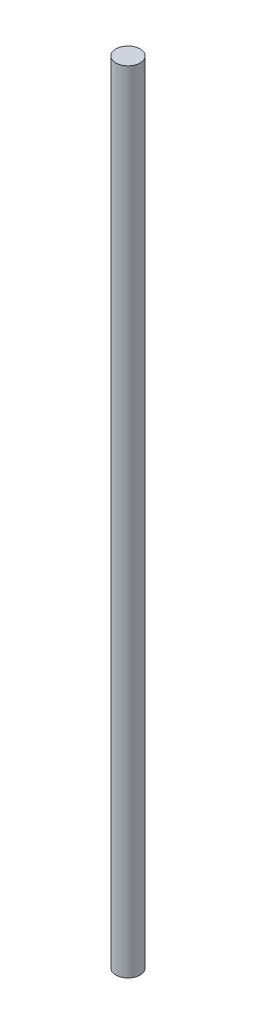
ISO-10303-21;
HEADER;
FILE_DESCRIPTION(('STEP AP214'),'2;1');
FILE_NAME('part.step','',(''),(''),'','','');
FILE_SCHEMA(('AUTOMOTIVE_DESIGN { 1 0 10303 214 1 1 1 1 }'));
ENDSEC;
DATA;
#1=APPLICATION_CONTEXT('core data for automotive mechanical design processes');
#2=APPLICATION_PROTOCOL_DEFINITION('international standard','automotive_design',2000,#1);
#3=PRODUCT_CONTEXT('',#1,'mechanical');
#4=PRODUCT('Part','Part','',(#3));
#5=PRODUCT_RELATED_PRODUCT_CATEGORY('part','',(#4));
#6=PRODUCT_DEFINITION_FORMATION('','',#4);
#7=PRODUCT_DEFINITION_CONTEXT('part definition',#1,'design');
#8=PRODUCT_DEFINITION('design','',#6,#7);
#9=PRODUCT_DEFINITION_SHAPE('','',#8);
#10=(LENGTH_UNIT() NAMED_UNIT(*) SI_UNIT(.MILLI.,.METRE.));
#11=(NAMED_UNIT(*) PLANE_ANGLE_UNIT() SI_UNIT($,.RADIAN.));
#12=(NAMED_UNIT(*) SI_UNIT($,.STERADIAN.) SOLID_ANGLE_UNIT());
#13=UNCERTAINTY_MEASURE_WITH_UNIT(LENGTH_MEASURE(1.E-05),#10,'distance_accuracy_value','');
#14=(GEOMETRIC_REPRESENTATION_CONTEXT(3) GLOBAL_UNCERTAINTY_ASSIGNED_CONTEXT((#13)) GLOBAL_UNIT_ASSIGNED_CONTEXT((#10,
#11,#12)) REPRESENTATION_CONTEXT('',''));
#15=CARTESIAN_POINT('',(0.,0.,0.));
#16=DIRECTION('',(0.,0.,1.));
#17=DIRECTION('',(1.,0.,0.));
#18=AXIS2_PLACEMENT_3D('',#15,#16,#17);
#19=CARTESIAN_POINT('',(350.,900.,-400.));
#20=DIRECTION('',(0.,-1.,0.));
#21=DIRECTION('',(0.,0.,-1.));
#22=AXIS2_PLACEMENT_3D('',#19,#20,#21);
#23=CYLINDRICAL_SURFACE('',#22,8.00000000000001);
#24=CARTESIAN_POINT('',(350.,900.,-400.));
#25=DIRECTION('',(0.,1.,0.));
#26=DIRECTION('',(0.,0.,1.));
#27=AXIS2_PLACEMENT_3D('',#24,#25,#26);
#28=CIRCLE('',#27,8.00000000000001);
#29=CARTESIAN_POINT('',(350.,900.,-392.));
#30=VERTEX_POINT('',#29);
#31=EDGE_CURVE('E10',#30,#30,#28,.T.);
#32=ORIENTED_EDGE('',*,*,#31,.F.);
#33=EDGE_LOOP('',(#32));
#34=FACE_BOUND('',#33,.T.);
#35=CARTESIAN_POINT('',(350.,380.,-400.));
#36=DIRECTION('',(0.,1.,0.));
#37=DIRECTION('',(0.,0.,1.));
#38=AXIS2_PLACEMENT_3D('',#35,#36,#37);
#39=CIRCLE('',#38,8.00000000000001);
#40=CARTESIAN_POINT('',(350.,380.,-392.));
#41=VERTEX_POINT('',#40);
#42=EDGE_CURVE('E40',#41,#41,#39,.T.);
#43=ORIENTED_EDGE('',*,*,#42,.T.);
#44=EDGE_LOOP('',(#43));
#45=FACE_BOUND('',#44,.T.);
#46=ADVANCED_FACE('F37',(#34,#45),#23,.T.);
#47=CARTESIAN_POINT('',(350.,900.,-400.));
#48=DIRECTION('',(0.,1.,0.));
#49=DIRECTION('',(0.,0.,1.));
#50=AXIS2_PLACEMENT_3D('',#47,#48,#49);
#51=PLANE('',#50);
#52=ORIENTED_EDGE('',*,*,#31,.T.);
#53=EDGE_LOOP('',(#52));
#54=FACE_BOUND('',#53,.T.);
#55=ADVANCED_FACE('F52',(#54),#51,.T.);
#56=CARTESIAN_POINT('',(350.,380.,-400.));
#57=DIRECTION('',(0.,1.,0.));
#58=DIRECTION('',(0.,0.,1.));
#59=AXIS2_PLACEMENT_3D('',#56,#57,#58);
#60=PLANE('',#59);
#61=ORIENTED_EDGE('',*,*,#42,.F.);
#62=EDGE_LOOP('',(#61));
#63=FACE_BOUND('',#62,.T.);
#64=ADVANCED_FACE('F50',(#63),#60,.F.);
#65=CLOSED_SHELL('',(#46,#55,#64));
#66=MANIFOLD_SOLID_BREP('B2',#65);
#67=ADVANCED_BREP_SHAPE_REPRESENTATION('',(#18,#66),#14);
#68=SHAPE_DEFINITION_REPRESENTATION(#9,#67);
ENDSEC;
END-ISO-10303-21;
